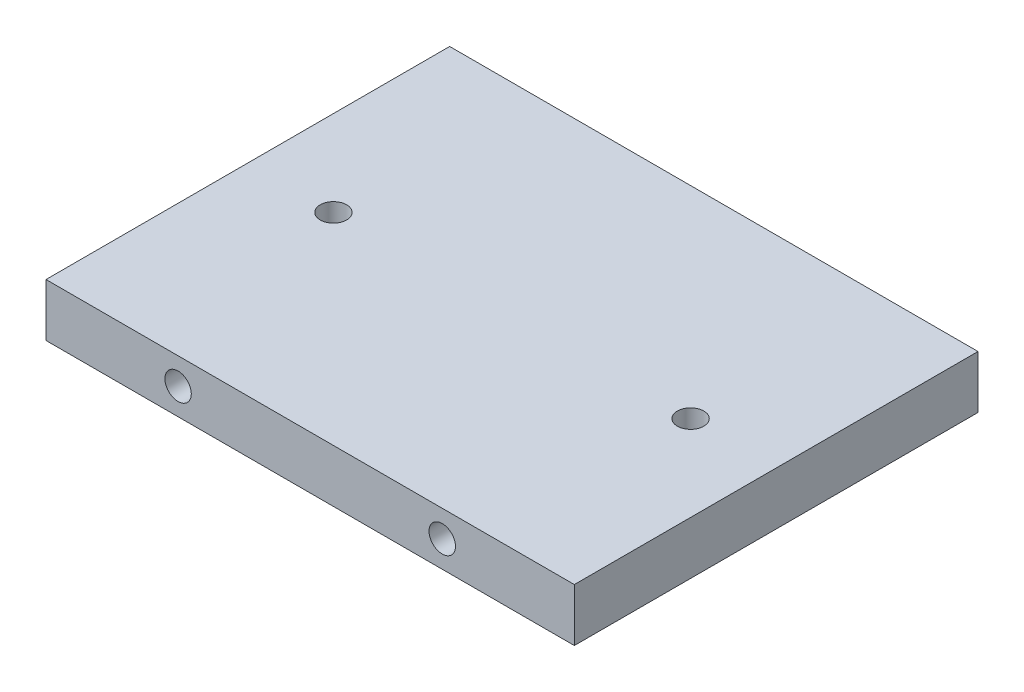
ISO-10303-21;
HEADER;
FILE_DESCRIPTION(('STEP AP214'),'2;1');
FILE_NAME('part.step','',(''),(''),'','','');
FILE_SCHEMA(('AUTOMOTIVE_DESIGN { 1 0 10303 214 1 1 1 1 }'));
ENDSEC;
DATA;
#1=APPLICATION_CONTEXT('core data for automotive mechanical design processes');
#2=APPLICATION_PROTOCOL_DEFINITION('international standard','automotive_design',2000,#1);
#3=PRODUCT_CONTEXT('',#1,'mechanical');
#4=PRODUCT('Part','Part','',(#3));
#5=PRODUCT_RELATED_PRODUCT_CATEGORY('part','',(#4));
#6=PRODUCT_DEFINITION_FORMATION('','',#4);
#7=PRODUCT_DEFINITION_CONTEXT('part definition',#1,'design');
#8=PRODUCT_DEFINITION('design','',#6,#7);
#9=PRODUCT_DEFINITION_SHAPE('','',#8);
#10=(LENGTH_UNIT() NAMED_UNIT(*) SI_UNIT(.MILLI.,.METRE.));
#11=(NAMED_UNIT(*) PLANE_ANGLE_UNIT() SI_UNIT($,.RADIAN.));
#12=(NAMED_UNIT(*) SI_UNIT($,.STERADIAN.) SOLID_ANGLE_UNIT());
#13=UNCERTAINTY_MEASURE_WITH_UNIT(LENGTH_MEASURE(1.E-05),#10,'distance_accuracy_value','');
#14=(GEOMETRIC_REPRESENTATION_CONTEXT(3) GLOBAL_UNCERTAINTY_ASSIGNED_CONTEXT((#13)) GLOBAL_UNIT_ASSIGNED_CONTEXT((#10,
#11,#12)) REPRESENTATION_CONTEXT('',''));
#15=CARTESIAN_POINT('',(0.,0.,0.));
#16=DIRECTION('',(0.,0.,1.));
#17=DIRECTION('',(1.,0.,0.));
#18=AXIS2_PLACEMENT_3D('',#15,#16,#17);
#19=CARTESIAN_POINT('',(0.,12.7,0.));
#20=DIRECTION('',(0.,-1.,0.));
#21=DIRECTION('',(0.,0.,-1.));
#22=AXIS2_PLACEMENT_3D('',#19,#20,#21);
#23=PLANE('',#22);
#24=DIRECTION('',(-1.,0.,0.));
#25=VECTOR('',#24,1.);
#26=CARTESIAN_POINT('',(-63.5,12.7,-97.028));
#27=LINE('',#26,#25);
#28=CARTESIAN_POINT('',(63.5,12.7,-97.028));
#29=VERTEX_POINT('',#28);
#30=CARTESIAN_POINT('',(-63.5,12.7,-97.028));
#31=VERTEX_POINT('',#30);
#32=EDGE_CURVE('E53',#29,#31,#27,.T.);
#33=ORIENTED_EDGE('',*,*,#32,.T.);
#34=DIRECTION('',(0.,0.,1.));
#35=VECTOR('',#34,1.);
#36=CARTESIAN_POINT('',(-63.5,12.7,0.));
#37=LINE('',#36,#35);
#38=CARTESIAN_POINT('',(-63.5,12.7,0.));
#39=VERTEX_POINT('',#38);
#40=EDGE_CURVE('E84',#31,#39,#37,.T.);
#41=ORIENTED_EDGE('',*,*,#40,.T.);
#42=DIRECTION('',(1.,0.,0.));
#43=VECTOR('',#42,1.);
#44=CARTESIAN_POINT('',(63.5,12.7,0.));
#45=LINE('',#44,#43);
#46=CARTESIAN_POINT('',(63.5,12.7,0.));
#47=VERTEX_POINT('',#46);
#48=EDGE_CURVE('E88',#39,#47,#45,.T.);
#49=ORIENTED_EDGE('',*,*,#48,.T.);
#50=DIRECTION('',(0.,0.,-1.));
#51=VECTOR('',#50,1.);
#52=CARTESIAN_POINT('',(63.5,12.7,-97.028));
#53=LINE('',#52,#51);
#54=EDGE_CURVE('E95',#47,#29,#53,.T.);
#55=ORIENTED_EDGE('',*,*,#54,.T.);
#56=EDGE_LOOP('',(#33,#41,#49,#55));
#57=FACE_BOUND('',#56,.T.);
#58=CARTESIAN_POINT('',(-42.926,12.7,-48.514));
#59=DIRECTION('',(0.,1.,0.));
#60=DIRECTION('',(0.,0.,1.));
#61=AXIS2_PLACEMENT_3D('',#58,#59,#60);
#62=CIRCLE('',#61,3.175);
#63=CARTESIAN_POINT('',(-42.926,12.7,-45.339));
#64=VERTEX_POINT('',#63);
#65=EDGE_CURVE('E102',#64,#64,#62,.T.);
#66=ORIENTED_EDGE('',*,*,#65,.F.);
#67=EDGE_LOOP('',(#66));
#68=FACE_BOUND('',#67,.T.);
#69=CARTESIAN_POINT('',(42.926,12.7,-48.514));
#70=DIRECTION('',(0.,1.,0.));
#71=DIRECTION('',(0.,0.,1.));
#72=AXIS2_PLACEMENT_3D('',#69,#70,#71);
#73=CIRCLE('',#72,3.175);
#74=CARTESIAN_POINT('',(42.926,12.7,-45.339));
#75=VERTEX_POINT('',#74);
#76=EDGE_CURVE('E165',#75,#75,#73,.T.);
#77=ORIENTED_EDGE('',*,*,#76,.F.);
#78=EDGE_LOOP('',(#77));
#79=FACE_BOUND('',#78,.T.);
#80=ADVANCED_FACE('F36',(#57,#68,#79),#23,.F.);
#81=CARTESIAN_POINT('',(0.,0.,0.));
#82=DIRECTION('',(0.,-1.,0.));
#83=DIRECTION('',(0.,0.,-1.));
#84=AXIS2_PLACEMENT_3D('',#81,#82,#83);
#85=PLANE('',#84);
#86=CARTESIAN_POINT('',(-42.926,0.,-48.514));
#87=DIRECTION('',(0.,1.,0.));
#88=DIRECTION('',(0.,0.,1.));
#89=AXIS2_PLACEMENT_3D('',#86,#87,#88);
#90=CIRCLE('',#89,3.175);
#91=CARTESIAN_POINT('',(-42.926,0.,-45.339));
#92=VERTEX_POINT('',#91);
#93=EDGE_CURVE('E168',#92,#92,#90,.T.);
#94=ORIENTED_EDGE('',*,*,#93,.T.);
#95=EDGE_LOOP('',(#94));
#96=FACE_BOUND('',#95,.T.);
#97=DIRECTION('',(0.,0.,1.));
#98=VECTOR('',#97,1.);
#99=CARTESIAN_POINT('',(-63.5,0.,0.));
#100=LINE('',#99,#98);
#101=CARTESIAN_POINT('',(-63.5,0.,-97.028));
#102=VERTEX_POINT('',#101);
#103=CARTESIAN_POINT('',(-63.5,0.,0.));
#104=VERTEX_POINT('',#103);
#105=EDGE_CURVE('E91',#102,#104,#100,.T.);
#106=ORIENTED_EDGE('',*,*,#105,.F.);
#107=DIRECTION('',(-1.,0.,0.));
#108=VECTOR('',#107,1.);
#109=CARTESIAN_POINT('',(0.,0.,-97.028));
#110=LINE('',#109,#108);
#111=CARTESIAN_POINT('',(63.5,0.,-97.028));
#112=VERTEX_POINT('',#111);
#113=EDGE_CURVE('E105',#112,#102,#110,.T.);
#114=ORIENTED_EDGE('',*,*,#113,.F.);
#115=DIRECTION('',(0.,0.,-1.));
#116=VECTOR('',#115,1.);
#117=CARTESIAN_POINT('',(63.5,0.,-97.028));
#118=LINE('',#117,#116);
#119=CARTESIAN_POINT('',(63.5,0.,0.));
#120=VERTEX_POINT('',#119);
#121=EDGE_CURVE('E78',#120,#112,#118,.T.);
#122=ORIENTED_EDGE('',*,*,#121,.F.);
#123=DIRECTION('',(1.,0.,0.));
#124=VECTOR('',#123,1.);
#125=CARTESIAN_POINT('',(63.5,0.,0.));
#126=LINE('',#125,#124);
#127=EDGE_CURVE('E71',#104,#120,#126,.T.);
#128=ORIENTED_EDGE('',*,*,#127,.F.);
#129=EDGE_LOOP('',(#106,#114,#122,#128));
#130=FACE_BOUND('',#129,.T.);
#131=CARTESIAN_POINT('',(42.926,0.,-48.514));
#132=DIRECTION('',(0.,1.,0.));
#133=DIRECTION('',(0.,0.,1.));
#134=AXIS2_PLACEMENT_3D('',#131,#132,#133);
#135=CIRCLE('',#134,3.175);
#136=CARTESIAN_POINT('',(42.926,0.,-45.339));
#137=VERTEX_POINT('',#136);
#138=EDGE_CURVE('E157',#137,#137,#135,.T.);
#139=ORIENTED_EDGE('',*,*,#138,.T.);
#140=EDGE_LOOP('',(#139));
#141=FACE_BOUND('',#140,.T.);
#142=ADVANCED_FACE('F111',(#96,#130,#141),#85,.T.);
#143=CARTESIAN_POINT('',(-63.5,12.7,0.));
#144=DIRECTION('',(1.,0.,0.));
#145=DIRECTION('',(0.,0.,-1.));
#146=AXIS2_PLACEMENT_3D('',#143,#144,#145);
#147=PLANE('',#146);
#148=ORIENTED_EDGE('',*,*,#105,.T.);
#149=DIRECTION('',(0.,-1.,0.));
#150=VECTOR('',#149,1.);
#151=CARTESIAN_POINT('',(-63.5,12.7,0.));
#152=LINE('',#151,#150);
#153=EDGE_CURVE('E45',#39,#104,#152,.T.);
#154=ORIENTED_EDGE('',*,*,#153,.F.);
#155=ORIENTED_EDGE('',*,*,#40,.F.);
#156=DIRECTION('',(0.,-1.,0.));
#157=VECTOR('',#156,1.);
#158=CARTESIAN_POINT('',(-63.5,12.7,-97.028));
#159=LINE('',#158,#157);
#160=EDGE_CURVE('E11',#31,#102,#159,.T.);
#161=ORIENTED_EDGE('',*,*,#160,.T.);
#162=EDGE_LOOP('',(#148,#154,#155,#161));
#163=FACE_BOUND('',#162,.T.);
#164=ADVANCED_FACE('F38',(#163),#147,.F.);
#165=CARTESIAN_POINT('',(63.5,12.7,0.));
#166=DIRECTION('',(0.,0.,-1.));
#167=DIRECTION('',(-1.,0.,0.));
#168=AXIS2_PLACEMENT_3D('',#165,#166,#167);
#169=PLANE('',#168);
#170=CARTESIAN_POINT('',(-31.75,6.35,0.));
#171=DIRECTION('',(0.,0.,1.));
#172=DIRECTION('',(1.,0.,0.));
#173=AXIS2_PLACEMENT_3D('',#170,#171,#172);
#174=CIRCLE('',#173,3.175);
#175=CARTESIAN_POINT('',(-28.575,6.35,0.));
#176=VERTEX_POINT('',#175);
#177=EDGE_CURVE('E153',#176,#176,#174,.T.);
#178=ORIENTED_EDGE('',*,*,#177,.F.);
#179=EDGE_LOOP('',(#178));
#180=FACE_BOUND('',#179,.T.);
#181=CARTESIAN_POINT('',(31.75,6.35,0.));
#182=DIRECTION('',(0.,0.,1.));
#183=DIRECTION('',(1.,0.,0.));
#184=AXIS2_PLACEMENT_3D('',#181,#182,#183);
#185=CIRCLE('',#184,3.175);
#186=CARTESIAN_POINT('',(34.925,6.35,0.));
#187=VERTEX_POINT('',#186);
#188=EDGE_CURVE('E160',#187,#187,#185,.T.);
#189=ORIENTED_EDGE('',*,*,#188,.F.);
#190=EDGE_LOOP('',(#189));
#191=FACE_BOUND('',#190,.T.);
#192=ORIENTED_EDGE('',*,*,#127,.T.);
#193=DIRECTION('',(0.,-1.,0.));
#194=VECTOR('',#193,1.);
#195=CARTESIAN_POINT('',(63.5,12.7,0.));
#196=LINE('',#195,#194);
#197=EDGE_CURVE('E92',#47,#120,#196,.T.);
#198=ORIENTED_EDGE('',*,*,#197,.F.);
#199=ORIENTED_EDGE('',*,*,#48,.F.);
#200=ORIENTED_EDGE('',*,*,#153,.T.);
#201=EDGE_LOOP('',(#192,#198,#199,#200));
#202=FACE_BOUND('',#201,.T.);
#203=ADVANCED_FACE('F93',(#180,#191,#202),#169,.F.);
#204=CARTESIAN_POINT('',(63.5,12.7,-97.028));
#205=DIRECTION('',(-1.,0.,0.));
#206=DIRECTION('',(0.,0.,1.));
#207=AXIS2_PLACEMENT_3D('',#204,#205,#206);
#208=PLANE('',#207);
#209=ORIENTED_EDGE('',*,*,#121,.T.);
#210=DIRECTION('',(0.,-1.,0.));
#211=VECTOR('',#210,1.);
#212=CARTESIAN_POINT('',(63.5,12.7,-97.028));
#213=LINE('',#212,#211);
#214=EDGE_CURVE('E97',#29,#112,#213,.T.);
#215=ORIENTED_EDGE('',*,*,#214,.F.);
#216=ORIENTED_EDGE('',*,*,#54,.F.);
#217=ORIENTED_EDGE('',*,*,#197,.T.);
#218=EDGE_LOOP('',(#209,#215,#216,#217));
#219=FACE_BOUND('',#218,.T.);
#220=ADVANCED_FACE('F108',(#219),#208,.F.);
#221=CARTESIAN_POINT('',(0.,12.7,-97.028));
#222=DIRECTION('',(0.,0.,1.));
#223=DIRECTION('',(1.,0.,0.));
#224=AXIS2_PLACEMENT_3D('',#221,#222,#223);
#225=PLANE('',#224);
#226=CARTESIAN_POINT('',(-31.75,6.35,-97.028));
#227=DIRECTION('',(0.,0.,1.));
#228=DIRECTION('',(1.,0.,0.));
#229=AXIS2_PLACEMENT_3D('',#226,#227,#228);
#230=CIRCLE('',#229,3.175);
#231=CARTESIAN_POINT('',(-28.575,6.35,-97.028));
#232=VERTEX_POINT('',#231);
#233=EDGE_CURVE('E150',#232,#232,#230,.T.);
#234=ORIENTED_EDGE('',*,*,#233,.T.);
#235=EDGE_LOOP('',(#234));
#236=FACE_BOUND('',#235,.T.);
#237=CARTESIAN_POINT('',(31.75,6.35,-97.028));
#238=DIRECTION('',(0.,0.,1.));
#239=DIRECTION('',(1.,0.,0.));
#240=AXIS2_PLACEMENT_3D('',#237,#238,#239);
#241=CIRCLE('',#240,3.175);
#242=CARTESIAN_POINT('',(34.925,6.35,-97.028));
#243=VERTEX_POINT('',#242);
#244=EDGE_CURVE('E155',#243,#243,#241,.T.);
#245=ORIENTED_EDGE('',*,*,#244,.T.);
#246=EDGE_LOOP('',(#245));
#247=FACE_BOUND('',#246,.T.);
#248=ORIENTED_EDGE('',*,*,#113,.T.);
#249=ORIENTED_EDGE('',*,*,#160,.F.);
#250=ORIENTED_EDGE('',*,*,#32,.F.);
#251=ORIENTED_EDGE('',*,*,#214,.T.);
#252=EDGE_LOOP('',(#248,#249,#250,#251));
#253=FACE_BOUND('',#252,.T.);
#254=ADVANCED_FACE('F113',(#236,#247,#253),#225,.F.);
#255=CARTESIAN_POINT('',(-42.926,12.7,-48.514));
#256=DIRECTION('',(0.,-1.,0.));
#257=DIRECTION('',(0.,0.,-1.));
#258=AXIS2_PLACEMENT_3D('',#255,#256,#257);
#259=CYLINDRICAL_SURFACE('',#258,3.175);
#260=ORIENTED_EDGE('',*,*,#65,.T.);
#261=EDGE_LOOP('',(#260));
#262=FACE_BOUND('',#261,.T.);
#263=ORIENTED_EDGE('',*,*,#93,.F.);
#264=EDGE_LOOP('',(#263));
#265=FACE_BOUND('',#264,.T.);
#266=ADVANCED_FACE('F115',(#262,#265),#259,.F.);
#267=CARTESIAN_POINT('',(42.926,12.7,-48.514));
#268=DIRECTION('',(0.,-1.,0.));
#269=DIRECTION('',(0.,0.,-1.));
#270=AXIS2_PLACEMENT_3D('',#267,#268,#269);
#271=CYLINDRICAL_SURFACE('',#270,3.175);
#272=ORIENTED_EDGE('',*,*,#76,.T.);
#273=EDGE_LOOP('',(#272));
#274=FACE_BOUND('',#273,.T.);
#275=ORIENTED_EDGE('',*,*,#138,.F.);
#276=EDGE_LOOP('',(#275));
#277=FACE_BOUND('',#276,.T.);
#278=ADVANCED_FACE('F122',(#274,#277),#271,.F.);
#279=CARTESIAN_POINT('',(31.75,6.35,-97.028));
#280=DIRECTION('',(0.,0.,1.));
#281=DIRECTION('',(1.,0.,0.));
#282=AXIS2_PLACEMENT_3D('',#279,#280,#281);
#283=CYLINDRICAL_SURFACE('',#282,3.175);
#284=ORIENTED_EDGE('',*,*,#244,.F.);
#285=EDGE_LOOP('',(#284));
#286=FACE_BOUND('',#285,.T.);
#287=ORIENTED_EDGE('',*,*,#188,.T.);
#288=EDGE_LOOP('',(#287));
#289=FACE_BOUND('',#288,.T.);
#290=ADVANCED_FACE('F138',(#286,#289),#283,.F.);
#291=CARTESIAN_POINT('',(-31.75,6.35,-97.028));
#292=DIRECTION('',(0.,0.,1.));
#293=DIRECTION('',(1.,0.,0.));
#294=AXIS2_PLACEMENT_3D('',#291,#292,#293);
#295=CYLINDRICAL_SURFACE('',#294,3.175);
#296=ORIENTED_EDGE('',*,*,#233,.F.);
#297=EDGE_LOOP('',(#296));
#298=FACE_BOUND('',#297,.T.);
#299=ORIENTED_EDGE('',*,*,#177,.T.);
#300=EDGE_LOOP('',(#299));
#301=FACE_BOUND('',#300,.T.);
#302=ADVANCED_FACE('F142',(#298,#301),#295,.F.);
#303=CLOSED_SHELL('',(#80,#142,#164,#203,#220,#254,#266,#278,#290,#302));
#304=MANIFOLD_SOLID_BREP('B2',#303);
#305=ADVANCED_BREP_SHAPE_REPRESENTATION('',(#18,#304),#14);
#306=SHAPE_DEFINITION_REPRESENTATION(#9,#305);
ENDSEC;
END-ISO-10303-21;
